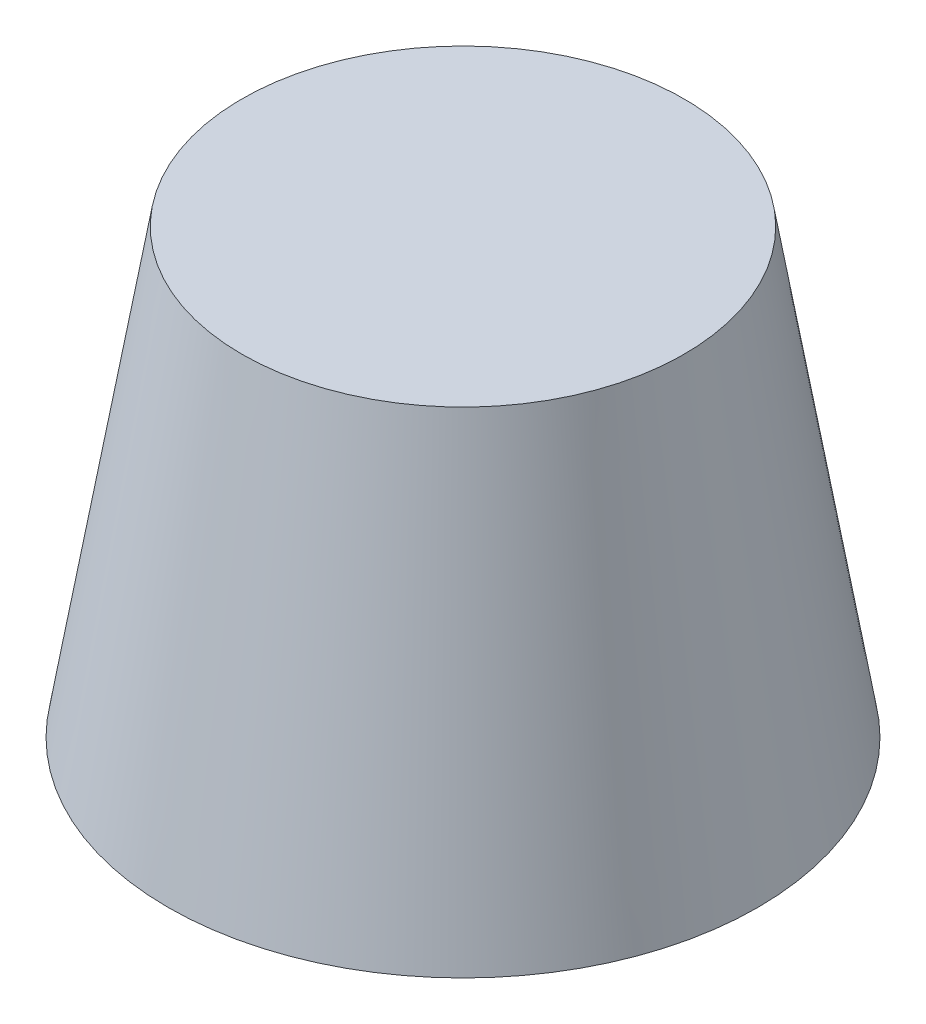
ISO-10303-21;
HEADER;
FILE_DESCRIPTION(('STEP AP214'),'2;1');
FILE_NAME('part.step','',(''),(''),'','','');
FILE_SCHEMA(('AUTOMOTIVE_DESIGN { 1 0 10303 214 1 1 1 1 }'));
ENDSEC;
DATA;
#1=APPLICATION_CONTEXT('core data for automotive mechanical design processes');
#2=APPLICATION_PROTOCOL_DEFINITION('international standard','automotive_design',2000,#1);
#3=PRODUCT_CONTEXT('',#1,'mechanical');
#4=PRODUCT('Part','Part','',(#3));
#5=PRODUCT_RELATED_PRODUCT_CATEGORY('part','',(#4));
#6=PRODUCT_DEFINITION_FORMATION('','',#4);
#7=PRODUCT_DEFINITION_CONTEXT('part definition',#1,'design');
#8=PRODUCT_DEFINITION('design','',#6,#7);
#9=PRODUCT_DEFINITION_SHAPE('','',#8);
#10=(LENGTH_UNIT() NAMED_UNIT(*) SI_UNIT(.MILLI.,.METRE.));
#11=(NAMED_UNIT(*) PLANE_ANGLE_UNIT() SI_UNIT($,.RADIAN.));
#12=(NAMED_UNIT(*) SI_UNIT($,.STERADIAN.) SOLID_ANGLE_UNIT());
#13=UNCERTAINTY_MEASURE_WITH_UNIT(LENGTH_MEASURE(1.E-05),#10,'distance_accuracy_value','');
#14=(GEOMETRIC_REPRESENTATION_CONTEXT(3) GLOBAL_UNCERTAINTY_ASSIGNED_CONTEXT((#13)) GLOBAL_UNIT_ASSIGNED_CONTEXT((#10,
#11,#12)) REPRESENTATION_CONTEXT('',''));
#15=CARTESIAN_POINT('',(0.,0.,0.));
#16=DIRECTION('',(0.,0.,1.));
#17=DIRECTION('',(1.,0.,0.));
#18=AXIS2_PLACEMENT_3D('',#15,#16,#17);
#19=CARTESIAN_POINT('',(0.,-12.,0.));
#20=DIRECTION('',(0.,1.,0.));
#21=DIRECTION('',(0.,0.,1.));
#22=AXIS2_PLACEMENT_3D('',#19,#20,#21);
#23=PLANE('',#22);
#24=CARTESIAN_POINT('',(0.,-12.,0.));
#25=DIRECTION('',(0.,-1.,0.));
#26=DIRECTION('',(0.,0.,-1.));
#27=AXIS2_PLACEMENT_3D('',#24,#25,#26);
#28=CIRCLE('',#27,3.15);
#29=CARTESIAN_POINT('',(2.74226184016042,-12.,-1.55));
#30=VERTEX_POINT('',#29);
#31=CARTESIAN_POINT('',(-2.74226184016042,-12.,-1.55));
#32=VERTEX_POINT('',#31);
#33=EDGE_CURVE('E75',#30,#32,#28,.T.);
#34=ORIENTED_EDGE('',*,*,#33,.F.);
#35=DIRECTION('',(1.,0.,0.));
#36=VECTOR('',#35,1.);
#37=CARTESIAN_POINT('',(0.,-12.,-1.55));
#38=LINE('',#37,#36);
#39=EDGE_CURVE('E56',#32,#30,#38,.T.);
#40=ORIENTED_EDGE('',*,*,#39,.F.);
#41=EDGE_LOOP('',(#34,#40));
#42=FACE_BOUND('',#41,.T.);
#43=CARTESIAN_POINT('',(0.,-12.,0.));
#44=DIRECTION('',(0.,1.,0.));
#45=DIRECTION('',(0.,0.,1.));
#46=AXIS2_PLACEMENT_3D('',#43,#44,#45);
#47=CIRCLE('',#46,8.);
#48=CARTESIAN_POINT('',(0.,-12.,8.));
#49=VERTEX_POINT('',#48);
#50=EDGE_CURVE('E12',#49,#49,#47,.T.);
#51=ORIENTED_EDGE('',*,*,#50,.F.);
#52=EDGE_LOOP('',(#51));
#53=FACE_BOUND('',#52,.T.);
#54=ADVANCED_FACE('F40',(#42,#53),#23,.F.);
#55=CARTESIAN_POINT('',(0.,0.,0.));
#56=DIRECTION('',(0.,1.,0.));
#57=DIRECTION('',(0.,0.,1.));
#58=AXIS2_PLACEMENT_3D('',#55,#56,#57);
#59=PLANE('',#58);
#60=CARTESIAN_POINT('',(0.,0.,0.));
#61=DIRECTION('',(0.,1.,0.));
#62=DIRECTION('',(0.,0.,1.));
#63=AXIS2_PLACEMENT_3D('',#60,#61,#62);
#64=CIRCLE('',#63,6.);
#65=CARTESIAN_POINT('',(0.,0.,6.));
#66=VERTEX_POINT('',#65);
#67=EDGE_CURVE('E49',#66,#66,#64,.T.);
#68=ORIENTED_EDGE('',*,*,#67,.T.);
#69=EDGE_LOOP('',(#68));
#70=FACE_BOUND('',#69,.T.);
#71=ADVANCED_FACE('F103',(#70),#59,.T.);
#72=CARTESIAN_POINT('',(0.,0.,0.));
#73=DIRECTION('',(0.,-1.,0.));
#74=DIRECTION('',(0.,0.,-1.));
#75=AXIS2_PLACEMENT_3D('',#72,#73,#74);
#76=CONICAL_SURFACE('',#75,6.,0.165148677414627);
#77=ORIENTED_EDGE('',*,*,#67,.F.);
#78=EDGE_LOOP('',(#77));
#79=FACE_BOUND('',#78,.T.);
#80=ORIENTED_EDGE('',*,*,#50,.T.);
#81=EDGE_LOOP('',(#80));
#82=FACE_BOUND('',#81,.T.);
#83=ADVANCED_FACE('F94',(#79,#82),#76,.T.);
#84=CARTESIAN_POINT('',(0.,-2.,-1.55));
#85=DIRECTION('',(0.,0.,-1.));
#86=DIRECTION('',(-1.,0.,0.));
#87=AXIS2_PLACEMENT_3D('',#84,#85,#86);
#88=PLANE('',#87);
#89=ORIENTED_EDGE('',*,*,#39,.T.);
#90=DIRECTION('',(0.,-1.,0.));
#91=VECTOR('',#90,1.);
#92=CARTESIAN_POINT('',(2.74226184016042,-2.,-1.55));
#93=LINE('',#92,#91);
#94=CARTESIAN_POINT('',(2.74226184016042,-2.,-1.55));
#95=VERTEX_POINT('',#94);
#96=EDGE_CURVE('E72',#95,#30,#93,.T.);
#97=ORIENTED_EDGE('',*,*,#96,.F.);
#98=DIRECTION('',(1.,0.,0.));
#99=VECTOR('',#98,1.);
#100=CARTESIAN_POINT('',(0.,-2.,-1.55));
#101=LINE('',#100,#99);
#102=CARTESIAN_POINT('',(-2.74226184016042,-2.,-1.55));
#103=VERTEX_POINT('',#102);
#104=EDGE_CURVE('E70',#103,#95,#101,.T.);
#105=ORIENTED_EDGE('',*,*,#104,.F.);
#106=DIRECTION('',(0.,-1.,0.));
#107=VECTOR('',#106,1.);
#108=CARTESIAN_POINT('',(-2.74226184016042,-2.,-1.55));
#109=LINE('',#108,#107);
#110=EDGE_CURVE('E64',#103,#32,#109,.T.);
#111=ORIENTED_EDGE('',*,*,#110,.T.);
#112=EDGE_LOOP('',(#89,#97,#105,#111));
#113=FACE_BOUND('',#112,.T.);
#114=ADVANCED_FACE('F68',(#113),#88,.F.);
#115=CARTESIAN_POINT('',(0.,-2.,0.));
#116=DIRECTION('',(0.,-1.,0.));
#117=DIRECTION('',(0.,0.,-1.));
#118=AXIS2_PLACEMENT_3D('',#115,#116,#117);
#119=CYLINDRICAL_SURFACE('',#118,3.15);
#120=ORIENTED_EDGE('',*,*,#33,.T.);
#121=ORIENTED_EDGE('',*,*,#110,.F.);
#122=CARTESIAN_POINT('',(0.,-2.,0.));
#123=DIRECTION('',(0.,-1.,0.));
#124=DIRECTION('',(0.,0.,-1.));
#125=AXIS2_PLACEMENT_3D('',#122,#123,#124);
#126=CIRCLE('',#125,3.15);
#127=EDGE_CURVE('E82',#95,#103,#126,.T.);
#128=ORIENTED_EDGE('',*,*,#127,.F.);
#129=ORIENTED_EDGE('',*,*,#96,.T.);
#130=EDGE_LOOP('',(#120,#121,#128,#129));
#131=FACE_BOUND('',#130,.T.);
#132=ADVANCED_FACE('F76',(#131),#119,.F.);
#133=CARTESIAN_POINT('',(0.,-2.,0.));
#134=DIRECTION('',(0.,-1.,0.));
#135=DIRECTION('',(0.,0.,-1.));
#136=AXIS2_PLACEMENT_3D('',#133,#134,#135);
#137=PLANE('',#136);
#138=ORIENTED_EDGE('',*,*,#104,.T.);
#139=ORIENTED_EDGE('',*,*,#127,.T.);
#140=EDGE_LOOP('',(#138,#139));
#141=FACE_BOUND('',#140,.T.);
#142=ADVANCED_FACE('F159',(#141),#137,.T.);
#143=CLOSED_SHELL('',(#54,#71,#83,#114,#132,#142));
#144=MANIFOLD_SOLID_BREP('B2',#143);
#145=ADVANCED_BREP_SHAPE_REPRESENTATION('',(#18,#144),#14);
#146=SHAPE_DEFINITION_REPRESENTATION(#9,#145);
ENDSEC;
END-ISO-10303-21;
